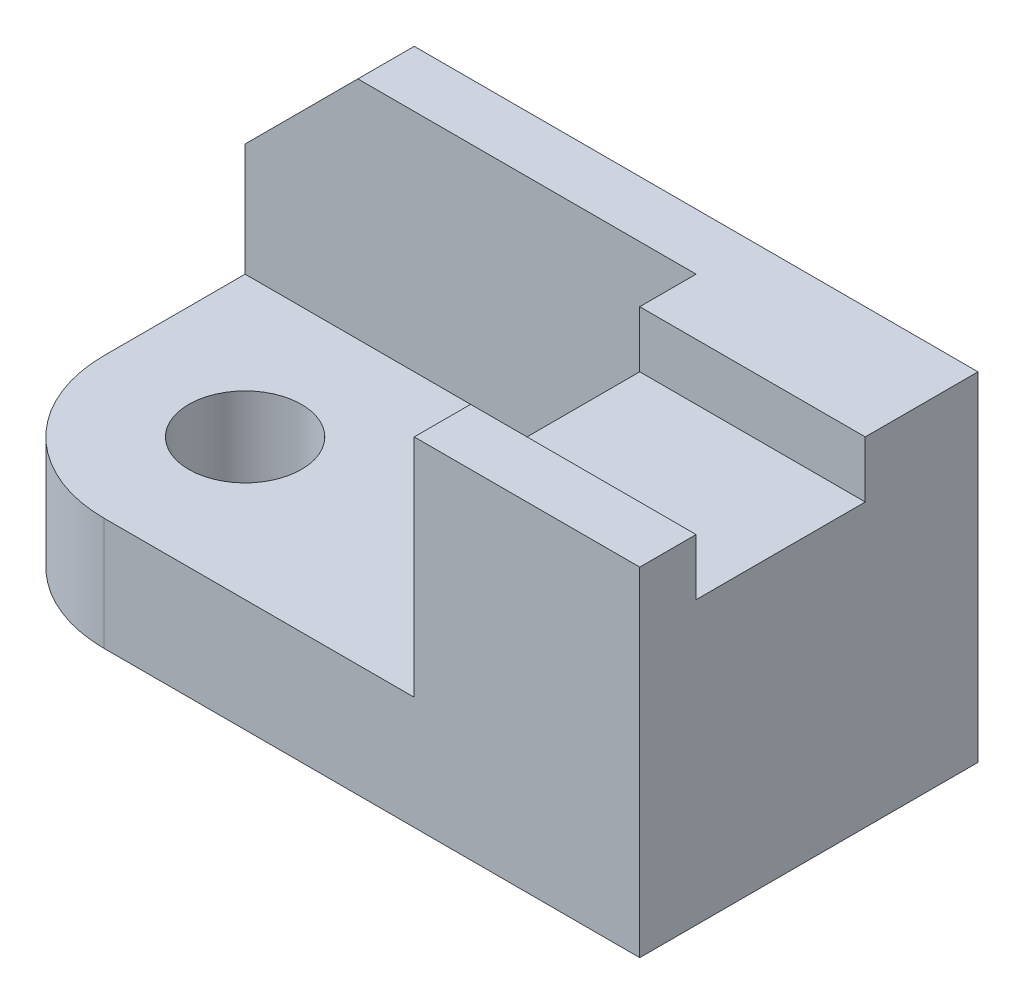
ISO-10303-21;
HEADER;
FILE_DESCRIPTION(('STEP AP214'),'2;1');
FILE_NAME('part.step','',(''),(''),'','','');
FILE_SCHEMA(('AUTOMOTIVE_DESIGN { 1 0 10303 214 1 1 1 1 }'));
ENDSEC;
DATA;
#1=APPLICATION_CONTEXT('core data for automotive mechanical design processes');
#2=APPLICATION_PROTOCOL_DEFINITION('international standard','automotive_design',2000,#1);
#3=PRODUCT_CONTEXT('',#1,'mechanical');
#4=PRODUCT('Part','Part','',(#3));
#5=PRODUCT_RELATED_PRODUCT_CATEGORY('part','',(#4));
#6=PRODUCT_DEFINITION_FORMATION('','',#4);
#7=PRODUCT_DEFINITION_CONTEXT('part definition',#1,'design');
#8=PRODUCT_DEFINITION('design','',#6,#7);
#9=PRODUCT_DEFINITION_SHAPE('','',#8);
#10=(LENGTH_UNIT() NAMED_UNIT(*) SI_UNIT(.MILLI.,.METRE.));
#11=(NAMED_UNIT(*) PLANE_ANGLE_UNIT() SI_UNIT($,.RADIAN.));
#12=(NAMED_UNIT(*) SI_UNIT($,.STERADIAN.) SOLID_ANGLE_UNIT());
#13=UNCERTAINTY_MEASURE_WITH_UNIT(LENGTH_MEASURE(1.E-05),#10,'distance_accuracy_value','');
#14=(GEOMETRIC_REPRESENTATION_CONTEXT(3) GLOBAL_UNCERTAINTY_ASSIGNED_CONTEXT((#13)) GLOBAL_UNIT_ASSIGNED_CONTEXT((#10,
#11,#12)) REPRESENTATION_CONTEXT('',''));
#15=CARTESIAN_POINT('',(0.,0.,0.));
#16=DIRECTION('',(0.,0.,1.));
#17=DIRECTION('',(1.,0.,0.));
#18=AXIS2_PLACEMENT_3D('',#15,#16,#17);
#19=CARTESIAN_POINT('',(0.,60.,0.));
#20=DIRECTION('',(0.,1.,0.));
#21=DIRECTION('',(0.,0.,1.));
#22=AXIS2_PLACEMENT_3D('',#19,#20,#21);
#23=PLANE('',#22);
#24=DIRECTION('',(-1.,0.,0.));
#25=VECTOR('',#24,1.);
#26=CARTESIAN_POINT('',(20.,60.,-9.99999999999999));
#27=LINE('',#26,#25);
#28=CARTESIAN_POINT('',(60.,60.,-9.99999999999999));
#29=VERTEX_POINT('',#28);
#30=CARTESIAN_POINT('',(20.,60.,-9.99999999999999));
#31=VERTEX_POINT('',#30);
#32=EDGE_CURVE('E149',#29,#31,#27,.T.);
#33=ORIENTED_EDGE('',*,*,#32,.F.);
#34=DIRECTION('',(0.,0.,-1.));
#35=VECTOR('',#34,1.);
#36=CARTESIAN_POINT('',(60.,60.,-30.));
#37=LINE('',#36,#35);
#38=CARTESIAN_POINT('',(60.,60.,-30.));
#39=VERTEX_POINT('',#38);
#40=EDGE_CURVE('E179',#29,#39,#37,.T.);
#41=ORIENTED_EDGE('',*,*,#40,.T.);
#42=DIRECTION('',(-1.,0.,0.));
#43=VECTOR('',#42,1.);
#44=CARTESIAN_POINT('',(-60.,60.,-30.));
#45=LINE('',#44,#43);
#46=CARTESIAN_POINT('',(-40.,60.,-30.));
#47=VERTEX_POINT('',#46);
#48=EDGE_CURVE('E183',#39,#47,#45,.T.);
#49=ORIENTED_EDGE('',*,*,#48,.T.);
#50=DIRECTION('',(0.,0.,1.));
#51=VECTOR('',#50,1.);
#52=CARTESIAN_POINT('',(-40.,60.,-20.));
#53=LINE('',#52,#51);
#54=CARTESIAN_POINT('',(-40.,60.,-20.));
#55=VERTEX_POINT('',#54);
#56=EDGE_CURVE('E213',#47,#55,#53,.T.);
#57=ORIENTED_EDGE('',*,*,#56,.T.);
#58=DIRECTION('',(1.,0.,0.));
#59=VECTOR('',#58,1.);
#60=CARTESIAN_POINT('',(-60.,60.,-20.));
#61=LINE('',#60,#59);
#62=CARTESIAN_POINT('',(20.,60.,-20.));
#63=VERTEX_POINT('',#62);
#64=EDGE_CURVE('E176',#55,#63,#61,.T.);
#65=ORIENTED_EDGE('',*,*,#64,.T.);
#66=DIRECTION('',(0.,0.,1.));
#67=VECTOR('',#66,1.);
#68=CARTESIAN_POINT('',(20.,60.,-20.));
#69=LINE('',#68,#67);
#70=EDGE_CURVE('E166',#63,#31,#69,.T.);
#71=ORIENTED_EDGE('',*,*,#70,.T.);
#72=EDGE_LOOP('',(#33,#41,#49,#57,#65,#71));
#73=FACE_BOUND('',#72,.T.);
#74=ADVANCED_FACE('F39',(#73),#23,.T.);
#75=CARTESIAN_POINT('',(0.,20.,0.));
#76=DIRECTION('',(0.,-1.,0.));
#77=DIRECTION('',(0.,0.,-1.));
#78=AXIS2_PLACEMENT_3D('',#75,#76,#77);
#79=PLANE('',#78);
#80=CARTESIAN_POINT('',(-35.,20.,5.));
#81=DIRECTION('',(0.,1.,0.));
#82=DIRECTION('',(0.,0.,1.));
#83=AXIS2_PLACEMENT_3D('',#80,#81,#82);
#84=CIRCLE('',#83,10.);
#85=CARTESIAN_POINT('',(-35.,20.,15.));
#86=VERTEX_POINT('',#85);
#87=EDGE_CURVE('E272',#86,#86,#84,.T.);
#88=ORIENTED_EDGE('',*,*,#87,.F.);
#89=EDGE_LOOP('',(#88));
#90=FACE_BOUND('',#89,.T.);
#91=DIRECTION('',(0.,0.,1.));
#92=VECTOR('',#91,1.);
#93=CARTESIAN_POINT('',(20.,20.,-20.));
#94=LINE('',#93,#92);
#95=CARTESIAN_POINT('',(20.,20.,-20.));
#96=VERTEX_POINT('',#95);
#97=CARTESIAN_POINT('',(20.,20.,30.));
#98=VERTEX_POINT('',#97);
#99=EDGE_CURVE('E161',#96,#98,#94,.T.);
#100=ORIENTED_EDGE('',*,*,#99,.F.);
#101=DIRECTION('',(1.,0.,0.));
#102=VECTOR('',#101,1.);
#103=CARTESIAN_POINT('',(-60.,20.,-20.));
#104=LINE('',#103,#102);
#105=CARTESIAN_POINT('',(-60.,20.,-20.));
#106=VERTEX_POINT('',#105);
#107=EDGE_CURVE('E169',#106,#96,#104,.T.);
#108=ORIENTED_EDGE('',*,*,#107,.F.);
#109=DIRECTION('',(0.,0.,1.));
#110=VECTOR('',#109,1.);
#111=CARTESIAN_POINT('',(-60.,20.,30.));
#112=LINE('',#111,#110);
#113=CARTESIAN_POINT('',(-60.,20.,5.));
#114=VERTEX_POINT('',#113);
#115=EDGE_CURVE('E191',#106,#114,#112,.T.);
#116=ORIENTED_EDGE('',*,*,#115,.T.);
#117=CARTESIAN_POINT('',(-35.,20.,5.));
#118=DIRECTION('',(0.,-1.,0.));
#119=DIRECTION('',(0.,0.,-1.));
#120=AXIS2_PLACEMENT_3D('',#117,#118,#119);
#121=CIRCLE('',#120,25.);
#122=CARTESIAN_POINT('',(-35.,20.,30.));
#123=VERTEX_POINT('',#122);
#124=EDGE_CURVE('E11',#114,#123,#121,.F.);
#125=ORIENTED_EDGE('',*,*,#124,.T.);
#126=DIRECTION('',(1.,0.,0.));
#127=VECTOR('',#126,1.);
#128=CARTESIAN_POINT('',(-60.,20.,30.));
#129=LINE('',#128,#127);
#130=EDGE_CURVE('E193',#123,#98,#129,.T.);
#131=ORIENTED_EDGE('',*,*,#130,.T.);
#132=EDGE_LOOP('',(#100,#108,#116,#125,#131));
#133=FACE_BOUND('',#132,.T.);
#134=ADVANCED_FACE('F239',(#90,#133),#79,.F.);
#135=CARTESIAN_POINT('',(-60.,60.,-20.));
#136=DIRECTION('',(0.,0.,-1.));
#137=DIRECTION('',(-1.,0.,0.));
#138=AXIS2_PLACEMENT_3D('',#135,#136,#137);
#139=PLANE('',#138);
#140=DIRECTION('',(0.,-1.,0.));
#141=VECTOR('',#140,1.);
#142=CARTESIAN_POINT('',(20.,124.031242374328,-20.));
#143=LINE('',#142,#141);
#144=EDGE_CURVE('E165',#63,#96,#143,.T.);
#145=ORIENTED_EDGE('',*,*,#144,.F.);
#146=ORIENTED_EDGE('',*,*,#64,.F.);
#147=DIRECTION('',(-0.707106781186547,-0.707106781186549,0.));
#148=VECTOR('',#147,1.);
#149=CARTESIAN_POINT('',(-40.,60.,-20.));
#150=LINE('',#149,#148);
#151=CARTESIAN_POINT('',(-60.,39.9999999999999,-20.));
#152=VERTEX_POINT('',#151);
#153=EDGE_CURVE('E216',#55,#152,#150,.T.);
#154=ORIENTED_EDGE('',*,*,#153,.T.);
#155=DIRECTION('',(0.,-1.,0.));
#156=VECTOR('',#155,1.);
#157=CARTESIAN_POINT('',(-60.,60.,-20.));
#158=LINE('',#157,#156);
#159=EDGE_CURVE('E186',#152,#106,#158,.T.);
#160=ORIENTED_EDGE('',*,*,#159,.T.);
#161=ORIENTED_EDGE('',*,*,#107,.T.);
#162=EDGE_LOOP('',(#145,#146,#154,#160,#161));
#163=FACE_BOUND('',#162,.T.);
#164=ADVANCED_FACE('F246',(#163),#139,.F.);
#165=CARTESIAN_POINT('',(60.,20.,30.));
#166=DIRECTION('',(-1.,0.,0.));
#167=DIRECTION('',(0.,0.,1.));
#168=AXIS2_PLACEMENT_3D('',#165,#166,#167);
#169=PLANE('',#168);
#170=ORIENTED_EDGE('',*,*,#40,.F.);
#171=DIRECTION('',(0.,1.,0.));
#172=VECTOR('',#171,1.);
#173=CARTESIAN_POINT('',(60.,50.,-9.99999999999999));
#174=LINE('',#173,#172);
#175=CARTESIAN_POINT('',(60.,50.,-9.99999999999999));
#176=VERTEX_POINT('',#175);
#177=EDGE_CURVE('E156',#176,#29,#174,.T.);
#178=ORIENTED_EDGE('',*,*,#177,.F.);
#179=DIRECTION('',(0.,0.,-1.));
#180=VECTOR('',#179,1.);
#181=CARTESIAN_POINT('',(60.,50.,-9.99999999999999));
#182=LINE('',#181,#180);
#183=CARTESIAN_POINT('',(60.,50.,20.));
#184=VERTEX_POINT('',#183);
#185=EDGE_CURVE('E142',#184,#176,#182,.T.);
#186=ORIENTED_EDGE('',*,*,#185,.F.);
#187=DIRECTION('',(0.,1.,0.));
#188=VECTOR('',#187,1.);
#189=CARTESIAN_POINT('',(60.,50.,20.));
#190=LINE('',#189,#188);
#191=CARTESIAN_POINT('',(60.,60.,20.));
#192=VERTEX_POINT('',#191);
#193=EDGE_CURVE('E140',#184,#192,#190,.T.);
#194=ORIENTED_EDGE('',*,*,#193,.T.);
#195=CARTESIAN_POINT('',(60.,60.,30.));
#196=VERTEX_POINT('',#195);
#197=EDGE_CURVE('E180',#196,#192,#37,.T.);
#198=ORIENTED_EDGE('',*,*,#197,.F.);
#199=DIRECTION('',(0.,-1.,0.));
#200=VECTOR('',#199,1.);
#201=CARTESIAN_POINT('',(60.,20.,30.));
#202=LINE('',#201,#200);
#203=CARTESIAN_POINT('',(60.,0.,30.));
#204=VERTEX_POINT('',#203);
#205=EDGE_CURVE('E197',#196,#204,#202,.T.);
#206=ORIENTED_EDGE('',*,*,#205,.T.);
#207=DIRECTION('',(0.,0.,-1.));
#208=VECTOR('',#207,1.);
#209=CARTESIAN_POINT('',(60.,0.,30.));
#210=LINE('',#209,#208);
#211=CARTESIAN_POINT('',(60.,0.,-30.));
#212=VERTEX_POINT('',#211);
#213=EDGE_CURVE('E190',#204,#212,#210,.T.);
#214=ORIENTED_EDGE('',*,*,#213,.T.);
#215=DIRECTION('',(0.,-1.,0.));
#216=VECTOR('',#215,1.);
#217=CARTESIAN_POINT('',(60.,20.,-30.));
#218=LINE('',#217,#216);
#219=EDGE_CURVE('E210',#39,#212,#218,.T.);
#220=ORIENTED_EDGE('',*,*,#219,.F.);
#221=EDGE_LOOP('',(#170,#178,#186,#194,#198,#206,#214,#220));
#222=FACE_BOUND('',#221,.T.);
#223=ADVANCED_FACE('F263',(#222),#169,.F.);
#224=CARTESIAN_POINT('',(-60.,20.,-30.));
#225=DIRECTION('',(0.,0.,1.));
#226=DIRECTION('',(1.,0.,0.));
#227=AXIS2_PLACEMENT_3D('',#224,#225,#226);
#228=PLANE('',#227);
#229=DIRECTION('',(0.,-1.,0.));
#230=VECTOR('',#229,1.);
#231=CARTESIAN_POINT('',(-60.,20.,-30.));
#232=LINE('',#231,#230);
#233=CARTESIAN_POINT('',(-60.,39.9999999999999,-30.));
#234=VERTEX_POINT('',#233);
#235=CARTESIAN_POINT('',(-60.,0.,-30.));
#236=VERTEX_POINT('',#235);
#237=EDGE_CURVE('E208',#234,#236,#232,.T.);
#238=ORIENTED_EDGE('',*,*,#237,.F.);
#239=DIRECTION('',(0.707106781186547,0.707106781186549,0.));
#240=VECTOR('',#239,1.);
#241=CARTESIAN_POINT('',(-40.,60.,-30.));
#242=LINE('',#241,#240);
#243=EDGE_CURVE('E220',#234,#47,#242,.T.);
#244=ORIENTED_EDGE('',*,*,#243,.T.);
#245=ORIENTED_EDGE('',*,*,#48,.F.);
#246=ORIENTED_EDGE('',*,*,#219,.T.);
#247=DIRECTION('',(-1.,0.,0.));
#248=VECTOR('',#247,1.);
#249=CARTESIAN_POINT('',(-60.,0.,-30.));
#250=LINE('',#249,#248);
#251=EDGE_CURVE('E200',#212,#236,#250,.T.);
#252=ORIENTED_EDGE('',*,*,#251,.T.);
#253=EDGE_LOOP('',(#238,#244,#245,#246,#252));
#254=FACE_BOUND('',#253,.T.);
#255=ADVANCED_FACE('F256',(#254),#228,.F.);
#256=CARTESIAN_POINT('',(-60.,20.,30.));
#257=DIRECTION('',(1.,0.,0.));
#258=DIRECTION('',(0.,0.,-1.));
#259=AXIS2_PLACEMENT_3D('',#256,#257,#258);
#260=PLANE('',#259);
#261=DIRECTION('',(0.,0.,1.));
#262=VECTOR('',#261,1.);
#263=CARTESIAN_POINT('',(-60.,0.,30.));
#264=LINE('',#263,#262);
#265=CARTESIAN_POINT('',(-60.,0.,5.));
#266=VERTEX_POINT('',#265);
#267=EDGE_CURVE('E203',#236,#266,#264,.T.);
#268=ORIENTED_EDGE('',*,*,#267,.T.);
#269=DIRECTION('',(0.,-1.,0.));
#270=VECTOR('',#269,1.);
#271=CARTESIAN_POINT('',(-60.,20.,5.));
#272=LINE('',#271,#270);
#273=EDGE_CURVE('E47',#266,#114,#272,.F.);
#274=ORIENTED_EDGE('',*,*,#273,.T.);
#275=ORIENTED_EDGE('',*,*,#115,.F.);
#276=ORIENTED_EDGE('',*,*,#159,.F.);
#277=DIRECTION('',(0.,0.,-1.));
#278=VECTOR('',#277,1.);
#279=CARTESIAN_POINT('',(-60.,39.9999999999999,-30.));
#280=LINE('',#279,#278);
#281=EDGE_CURVE('E218',#152,#234,#280,.T.);
#282=ORIENTED_EDGE('',*,*,#281,.T.);
#283=ORIENTED_EDGE('',*,*,#237,.T.);
#284=EDGE_LOOP('',(#268,#274,#275,#276,#282,#283));
#285=FACE_BOUND('',#284,.T.);
#286=ADVANCED_FACE('F233',(#285),#260,.F.);
#287=CARTESIAN_POINT('',(-60.,20.,30.));
#288=DIRECTION('',(0.,0.,-1.));
#289=DIRECTION('',(-1.,0.,0.));
#290=AXIS2_PLACEMENT_3D('',#287,#288,#289);
#291=PLANE('',#290);
#292=ORIENTED_EDGE('',*,*,#130,.F.);
#293=DIRECTION('',(0.,-1.,0.));
#294=VECTOR('',#293,1.);
#295=CARTESIAN_POINT('',(-35.,20.,30.));
#296=LINE('',#295,#294);
#297=CARTESIAN_POINT('',(-35.,0.,30.));
#298=VERTEX_POINT('',#297);
#299=EDGE_CURVE('E222',#123,#298,#296,.T.);
#300=ORIENTED_EDGE('',*,*,#299,.T.);
#301=DIRECTION('',(1.,0.,0.));
#302=VECTOR('',#301,1.);
#303=CARTESIAN_POINT('',(-60.,0.,30.));
#304=LINE('',#303,#302);
#305=EDGE_CURVE('E194',#298,#204,#304,.T.);
#306=ORIENTED_EDGE('',*,*,#305,.T.);
#307=ORIENTED_EDGE('',*,*,#205,.F.);
#308=DIRECTION('',(1.,0.,0.));
#309=VECTOR('',#308,1.);
#310=CARTESIAN_POINT('',(60.,60.,30.));
#311=LINE('',#310,#309);
#312=CARTESIAN_POINT('',(20.,60.,30.));
#313=VERTEX_POINT('',#312);
#314=EDGE_CURVE('E170',#313,#196,#311,.T.);
#315=ORIENTED_EDGE('',*,*,#314,.F.);
#316=DIRECTION('',(0.,-1.,0.));
#317=VECTOR('',#316,1.);
#318=CARTESIAN_POINT('',(20.,124.031242374328,30.));
#319=LINE('',#318,#317);
#320=EDGE_CURVE('E164',#313,#98,#319,.T.);
#321=ORIENTED_EDGE('',*,*,#320,.T.);
#322=EDGE_LOOP('',(#292,#300,#306,#307,#315,#321));
#323=FACE_BOUND('',#322,.T.);
#324=ADVANCED_FACE('F242',(#323),#291,.F.);
#325=CARTESIAN_POINT('',(0.,0.,0.));
#326=DIRECTION('',(0.,-1.,0.));
#327=DIRECTION('',(0.,0.,-1.));
#328=AXIS2_PLACEMENT_3D('',#325,#326,#327);
#329=PLANE('',#328);
#330=CARTESIAN_POINT('',(-35.,0.,5.));
#331=DIRECTION('',(0.,1.,0.));
#332=DIRECTION('',(0.,0.,1.));
#333=AXIS2_PLACEMENT_3D('',#330,#331,#332);
#334=CIRCLE('',#333,10.);
#335=CARTESIAN_POINT('',(-35.,0.,15.));
#336=VERTEX_POINT('',#335);
#337=EDGE_CURVE('E268',#336,#336,#334,.T.);
#338=ORIENTED_EDGE('',*,*,#337,.T.);
#339=EDGE_LOOP('',(#338));
#340=FACE_BOUND('',#339,.T.);
#341=ORIENTED_EDGE('',*,*,#305,.F.);
#342=CARTESIAN_POINT('',(-35.,0.,5.));
#343=DIRECTION('',(0.,-1.,0.));
#344=DIRECTION('',(0.,0.,-1.));
#345=AXIS2_PLACEMENT_3D('',#342,#343,#344);
#346=CIRCLE('',#345,25.);
#347=EDGE_CURVE('E225',#298,#266,#346,.T.);
#348=ORIENTED_EDGE('',*,*,#347,.T.);
#349=ORIENTED_EDGE('',*,*,#267,.F.);
#350=ORIENTED_EDGE('',*,*,#251,.F.);
#351=ORIENTED_EDGE('',*,*,#213,.F.);
#352=EDGE_LOOP('',(#341,#348,#349,#350,#351));
#353=FACE_BOUND('',#352,.T.);
#354=ADVANCED_FACE('F229',(#340,#353),#329,.T.);
#355=DIRECTION('',(1.,0.,0.));
#356=VECTOR('',#355,1.);
#357=CARTESIAN_POINT('',(20.,60.,20.));
#358=LINE('',#357,#356);
#359=CARTESIAN_POINT('',(20.,60.,20.));
#360=VERTEX_POINT('',#359);
#361=EDGE_CURVE('E267',#360,#192,#358,.T.);
#362=ORIENTED_EDGE('',*,*,#361,.F.);
#363=EDGE_CURVE('E154',#360,#313,#69,.T.);
#364=ORIENTED_EDGE('',*,*,#363,.T.);
#365=ORIENTED_EDGE('',*,*,#314,.T.);
#366=ORIENTED_EDGE('',*,*,#197,.T.);
#367=EDGE_LOOP('',(#362,#364,#365,#366));
#368=FACE_BOUND('',#367,.T.);
#369=ADVANCED_FACE('F266',(#368),#23,.T.);
#370=CARTESIAN_POINT('',(-40.,60.,0.));
#371=DIRECTION('',(-0.707106781186549,0.707106781186547,0.));
#372=DIRECTION('',(0.,0.,-1.));
#373=AXIS2_PLACEMENT_3D('',#370,#371,#372);
#374=PLANE('',#373);
#375=ORIENTED_EDGE('',*,*,#243,.F.);
#376=ORIENTED_EDGE('',*,*,#281,.F.);
#377=ORIENTED_EDGE('',*,*,#153,.F.);
#378=ORIENTED_EDGE('',*,*,#56,.F.);
#379=EDGE_LOOP('',(#375,#376,#377,#378));
#380=FACE_BOUND('',#379,.T.);
#381=ADVANCED_FACE('F252',(#380),#374,.T.);
#382=CARTESIAN_POINT('',(-35.,20.,5.));
#383=DIRECTION('',(0.,-1.,0.));
#384=DIRECTION('',(0.,0.,-1.));
#385=AXIS2_PLACEMENT_3D('',#382,#383,#384);
#386=CYLINDRICAL_SURFACE('',#385,25.);
#387=ORIENTED_EDGE('',*,*,#124,.F.);
#388=ORIENTED_EDGE('',*,*,#273,.F.);
#389=ORIENTED_EDGE('',*,*,#347,.F.);
#390=ORIENTED_EDGE('',*,*,#299,.F.);
#391=EDGE_LOOP('',(#387,#388,#389,#390));
#392=FACE_BOUND('',#391,.T.);
#393=ADVANCED_FACE('F41',(#392),#386,.T.);
#394=CARTESIAN_POINT('',(20.,124.031242374328,-20.));
#395=DIRECTION('',(1.,0.,0.));
#396=DIRECTION('',(0.,0.,-1.));
#397=AXIS2_PLACEMENT_3D('',#394,#395,#396);
#398=PLANE('',#397);
#399=DIRECTION('',(0.,0.,1.));
#400=VECTOR('',#399,1.);
#401=CARTESIAN_POINT('',(20.,50.,-9.99999999999999));
#402=LINE('',#401,#400);
#403=CARTESIAN_POINT('',(20.,50.,-9.99999999999999));
#404=VERTEX_POINT('',#403);
#405=CARTESIAN_POINT('',(20.,50.,20.));
#406=VERTEX_POINT('',#405);
#407=EDGE_CURVE('E143',#404,#406,#402,.T.);
#408=ORIENTED_EDGE('',*,*,#407,.F.);
#409=DIRECTION('',(0.,1.,0.));
#410=VECTOR('',#409,1.);
#411=CARTESIAN_POINT('',(20.,50.,-9.99999999999999));
#412=LINE('',#411,#410);
#413=EDGE_CURVE('E174',#404,#31,#412,.T.);
#414=ORIENTED_EDGE('',*,*,#413,.T.);
#415=ORIENTED_EDGE('',*,*,#70,.F.);
#416=ORIENTED_EDGE('',*,*,#144,.T.);
#417=ORIENTED_EDGE('',*,*,#99,.T.);
#418=ORIENTED_EDGE('',*,*,#320,.F.);
#419=ORIENTED_EDGE('',*,*,#363,.F.);
#420=DIRECTION('',(0.,1.,0.));
#421=VECTOR('',#420,1.);
#422=CARTESIAN_POINT('',(20.,50.,20.));
#423=LINE('',#422,#421);
#424=EDGE_CURVE('E137',#406,#360,#423,.T.);
#425=ORIENTED_EDGE('',*,*,#424,.F.);
#426=EDGE_LOOP('',(#408,#414,#415,#416,#417,#418,#419,#425));
#427=FACE_BOUND('',#426,.T.);
#428=ADVANCED_FACE('F152',(#427),#398,.F.);
#429=CARTESIAN_POINT('',(20.,50.,-9.99999999999999));
#430=DIRECTION('',(0.,0.,-1.));
#431=DIRECTION('',(-1.,0.,0.));
#432=AXIS2_PLACEMENT_3D('',#429,#430,#431);
#433=PLANE('',#432);
#434=ORIENTED_EDGE('',*,*,#32,.T.);
#435=ORIENTED_EDGE('',*,*,#413,.F.);
#436=DIRECTION('',(-1.,0.,0.));
#437=VECTOR('',#436,1.);
#438=CARTESIAN_POINT('',(20.,50.,-9.99999999999999));
#439=LINE('',#438,#437);
#440=EDGE_CURVE('E54',#176,#404,#439,.T.);
#441=ORIENTED_EDGE('',*,*,#440,.F.);
#442=ORIENTED_EDGE('',*,*,#177,.T.);
#443=EDGE_LOOP('',(#434,#435,#441,#442));
#444=FACE_BOUND('',#443,.T.);
#445=ADVANCED_FACE('F277',(#444),#433,.F.);
#446=CARTESIAN_POINT('',(20.,50.,20.));
#447=DIRECTION('',(0.,0.,1.));
#448=DIRECTION('',(1.,0.,0.));
#449=AXIS2_PLACEMENT_3D('',#446,#447,#448);
#450=PLANE('',#449);
#451=ORIENTED_EDGE('',*,*,#361,.T.);
#452=ORIENTED_EDGE('',*,*,#193,.F.);
#453=DIRECTION('',(1.,0.,0.));
#454=VECTOR('',#453,1.);
#455=CARTESIAN_POINT('',(20.,50.,20.));
#456=LINE('',#455,#454);
#457=EDGE_CURVE('E134',#406,#184,#456,.T.);
#458=ORIENTED_EDGE('',*,*,#457,.F.);
#459=ORIENTED_EDGE('',*,*,#424,.T.);
#460=EDGE_LOOP('',(#451,#452,#458,#459));
#461=FACE_BOUND('',#460,.T.);
#462=ADVANCED_FACE('F135',(#461),#450,.F.);
#463=CARTESIAN_POINT('',(0.,50.,0.));
#464=DIRECTION('',(0.,1.,0.));
#465=DIRECTION('',(0.,0.,1.));
#466=AXIS2_PLACEMENT_3D('',#463,#464,#465);
#467=PLANE('',#466);
#468=ORIENTED_EDGE('',*,*,#407,.T.);
#469=ORIENTED_EDGE('',*,*,#457,.T.);
#470=ORIENTED_EDGE('',*,*,#185,.T.);
#471=ORIENTED_EDGE('',*,*,#440,.T.);
#472=EDGE_LOOP('',(#468,#469,#470,#471));
#473=FACE_BOUND('',#472,.T.);
#474=ADVANCED_FACE('F146',(#473),#467,.T.);
#475=CARTESIAN_POINT('',(-35.,0.,5.));
#476=DIRECTION('',(0.,1.,0.));
#477=DIRECTION('',(0.,0.,1.));
#478=AXIS2_PLACEMENT_3D('',#475,#476,#477);
#479=CYLINDRICAL_SURFACE('',#478,10.);
#480=ORIENTED_EDGE('',*,*,#337,.F.);
#481=EDGE_LOOP('',(#480));
#482=FACE_BOUND('',#481,.T.);
#483=ORIENTED_EDGE('',*,*,#87,.T.);
#484=EDGE_LOOP('',(#483));
#485=FACE_BOUND('',#484,.T.);
#486=ADVANCED_FACE('F282',(#482,#485),#479,.F.);
#487=CLOSED_SHELL('',(#74,#134,#164,#223,#255,#286,#324,#354,#369,#381,#393,#428,#445,#462,#474,#486));
#488=MANIFOLD_SOLID_BREP('B2',#487);
#489=ADVANCED_BREP_SHAPE_REPRESENTATION('',(#18,#488),#14);
#490=SHAPE_DEFINITION_REPRESENTATION(#9,#489);
ENDSEC;
END-ISO-10303-21;
